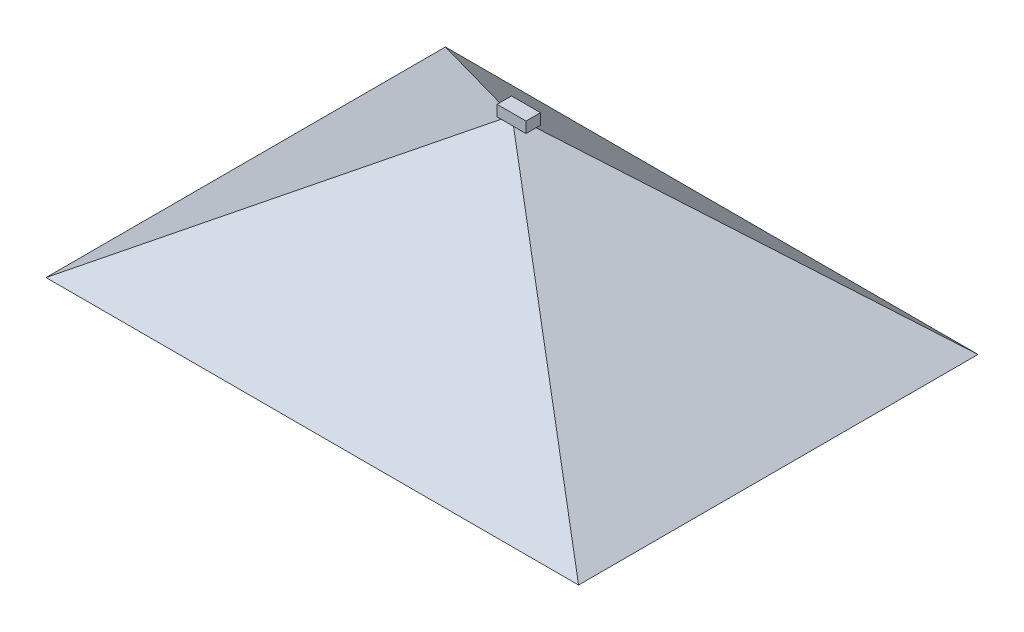
ISO-10303-21;
HEADER;
FILE_DESCRIPTION(('STEP AP214'),'2;1');
FILE_NAME('part.step','',(''),(''),'','','');
FILE_SCHEMA(('AUTOMOTIVE_DESIGN { 1 0 10303 214 1 1 1 1 }'));
ENDSEC;
DATA;
#1=APPLICATION_CONTEXT('core data for automotive mechanical design processes');
#2=APPLICATION_PROTOCOL_DEFINITION('international standard','automotive_design',2000,#1);
#3=PRODUCT_CONTEXT('',#1,'mechanical');
#4=PRODUCT('Part','Part','',(#3));
#5=PRODUCT_RELATED_PRODUCT_CATEGORY('part','',(#4));
#6=PRODUCT_DEFINITION_FORMATION('','',#4);
#7=PRODUCT_DEFINITION_CONTEXT('part definition',#1,'design');
#8=PRODUCT_DEFINITION('design','',#6,#7);
#9=PRODUCT_DEFINITION_SHAPE('','',#8);
#10=(LENGTH_UNIT() NAMED_UNIT(*) SI_UNIT(.MILLI.,.METRE.));
#11=(NAMED_UNIT(*) PLANE_ANGLE_UNIT() SI_UNIT($,.RADIAN.));
#12=(NAMED_UNIT(*) SI_UNIT($,.STERADIAN.) SOLID_ANGLE_UNIT());
#13=UNCERTAINTY_MEASURE_WITH_UNIT(LENGTH_MEASURE(1.E-05),#10,'distance_accuracy_value','');
#14=(GEOMETRIC_REPRESENTATION_CONTEXT(3) GLOBAL_UNCERTAINTY_ASSIGNED_CONTEXT((#13)) GLOBAL_UNIT_ASSIGNED_CONTEXT((#10,
#11,#12)) REPRESENTATION_CONTEXT('',''));
#15=CARTESIAN_POINT('',(0.,0.,0.));
#16=DIRECTION('',(0.,0.,1.));
#17=DIRECTION('',(1.,0.,0.));
#18=AXIS2_PLACEMENT_3D('',#15,#16,#17);
#19=CARTESIAN_POINT('',(0.,-302.26,0.));
#20=DIRECTION('',(0.,-1.,0.));
#21=DIRECTION('',(0.,0.,-1.));
#22=AXIS2_PLACEMENT_3D('',#19,#20,#21);
#23=PLANE('',#22);
#24=DIRECTION('',(0.,0.,1.));
#25=VECTOR('',#24,1.);
#26=CARTESIAN_POINT('',(455.529193006153,-302.26,-350.52));
#27=LINE('',#26,#25);
#28=CARTESIAN_POINT('',(455.529193006153,-302.26,-350.52));
#29=VERTEX_POINT('',#28);
#30=CARTESIAN_POINT('',(455.529193006153,-302.26,350.52));
#31=VERTEX_POINT('',#30);
#32=EDGE_CURVE('E92',#29,#31,#27,.T.);
#33=ORIENTED_EDGE('',*,*,#32,.T.);
#34=DIRECTION('',(-1.,0.,0.));
#35=VECTOR('',#34,1.);
#36=CARTESIAN_POINT('',(455.529193006153,-302.26,350.52));
#37=LINE('',#36,#35);
#38=CARTESIAN_POINT('',(-479.190806993847,-302.26,350.52));
#39=VERTEX_POINT('',#38);
#40=EDGE_CURVE('E76',#31,#39,#37,.T.);
#41=ORIENTED_EDGE('',*,*,#40,.T.);
#42=DIRECTION('',(0.,0.,-1.));
#43=VECTOR('',#42,1.);
#44=CARTESIAN_POINT('',(-479.190806993847,-302.26,-350.52));
#45=LINE('',#44,#43);
#46=CARTESIAN_POINT('',(-479.190806993847,-302.26,-350.52));
#47=VERTEX_POINT('',#46);
#48=EDGE_CURVE('E69',#39,#47,#45,.T.);
#49=ORIENTED_EDGE('',*,*,#48,.T.);
#50=DIRECTION('',(1.,0.,0.));
#51=VECTOR('',#50,1.);
#52=CARTESIAN_POINT('',(455.529193006153,-302.26,-350.52));
#53=LINE('',#52,#51);
#54=EDGE_CURVE('E89',#47,#29,#53,.T.);
#55=ORIENTED_EDGE('',*,*,#54,.T.);
#56=EDGE_LOOP('',(#33,#41,#49,#55));
#57=FACE_BOUND('',#56,.T.);
#58=ADVANCED_FACE('F49',(#57),#23,.T.);
#59=CARTESIAN_POINT('',(0.,1.44635091496229,-1.25769644779329));
#60=DIRECTION('',(0.,-0.754605522163505,0.656178714924787));
#61=DIRECTION('',(0.,-0.656178714924787,-0.754605522163505));
#62=AXIS2_PLACEMENT_3D('',#59,#60,#61);
#63=PLANE('',#62);
#64=DIRECTION('',(0.709267876932364,0.46256600669502,0.531950907699273));
#65=VECTOR('',#64,1.);
#66=CARTESIAN_POINT('',(-479.190806993847,-302.26,-350.52));
#67=LINE('',#66,#65);
#68=CARTESIAN_POINT('',(-11.8308069938468,2.53999999999993,0.));
#69=VERTEX_POINT('',#68);
#70=EDGE_CURVE('E98',#47,#69,#67,.T.);
#71=ORIENTED_EDGE('',*,*,#70,.T.);
#72=DIRECTION('',(-0.709267876932364,0.46256600669502,0.531950907699273));
#73=VECTOR('',#72,1.);
#74=CARTESIAN_POINT('',(455.529193006153,-302.26,-350.52));
#75=LINE('',#74,#73);
#76=EDGE_CURVE('E105',#29,#69,#75,.T.);
#77=ORIENTED_EDGE('',*,*,#76,.F.);
#78=ORIENTED_EDGE('',*,*,#54,.F.);
#79=EDGE_LOOP('',(#71,#77,#78));
#80=FACE_BOUND('',#79,.T.);
#81=ADVANCED_FACE('F109',(#80),#63,.F.);
#82=CARTESIAN_POINT('',(-2.36821163609489,-3.63125784201216,0.));
#83=DIRECTION('',(-0.546267780546922,-0.837610596838614,0.));
#84=DIRECTION('',(0.837610596838614,-0.546267780546922,0.));
#85=AXIS2_PLACEMENT_3D('',#82,#83,#84);
#86=PLANE('',#85);
#87=ORIENTED_EDGE('',*,*,#76,.T.);
#88=DIRECTION('',(-0.709267876932363,0.46256600669502,-0.531950907699273));
#89=VECTOR('',#88,1.);
#90=CARTESIAN_POINT('',(455.529193006153,-302.26,350.52));
#91=LINE('',#90,#89);
#92=EDGE_CURVE('E13',#31,#69,#91,.T.);
#93=ORIENTED_EDGE('',*,*,#92,.F.);
#94=ORIENTED_EDGE('',*,*,#32,.F.);
#95=EDGE_LOOP('',(#87,#93,#94));
#96=FACE_BOUND('',#95,.T.);
#97=ADVANCED_FACE('F104',(#96),#86,.F.);
#98=CARTESIAN_POINT('',(-4.69261481911875,7.19534272264874,0.));
#99=DIRECTION('',(0.546267780546922,-0.837610596838614,0.));
#100=DIRECTION('',(0.837610596838614,0.546267780546922,0.));
#101=AXIS2_PLACEMENT_3D('',#98,#99,#100);
#102=PLANE('',#101);
#103=DIRECTION('',(0.709267876932363,0.46256600669502,-0.531950907699273));
#104=VECTOR('',#103,1.);
#105=CARTESIAN_POINT('',(-479.190806993847,-302.26,350.52));
#106=LINE('',#105,#104);
#107=EDGE_CURVE('E61',#39,#69,#106,.T.);
#108=ORIENTED_EDGE('',*,*,#107,.T.);
#109=ORIENTED_EDGE('',*,*,#70,.F.);
#110=ORIENTED_EDGE('',*,*,#48,.F.);
#111=EDGE_LOOP('',(#108,#109,#110));
#112=FACE_BOUND('',#111,.T.);
#113=ADVANCED_FACE('F121',(#112),#102,.F.);
#114=CARTESIAN_POINT('',(0.,1.44635091496232,1.25769644779332));
#115=DIRECTION('',(0.,-0.754605522163505,-0.656178714924787));
#116=DIRECTION('',(0.,0.656178714924787,-0.754605522163505));
#117=AXIS2_PLACEMENT_3D('',#114,#115,#116);
#118=PLANE('',#117);
#119=ORIENTED_EDGE('',*,*,#92,.T.);
#120=ORIENTED_EDGE('',*,*,#107,.F.);
#121=ORIENTED_EDGE('',*,*,#40,.F.);
#122=EDGE_LOOP('',(#119,#120,#121));
#123=FACE_BOUND('',#122,.T.);
#124=ADVANCED_FACE('F51',(#123),#118,.F.);
#125=CLOSED_SHELL('',(#58,#81,#97,#113,#124));
#126=MANIFOLD_SOLID_BREP('B2',#125);
#127=CARTESIAN_POINT('',(-25.4,19.05,-12.7));
#128=DIRECTION('',(1.,0.,0.));
#129=DIRECTION('',(0.,0.,-1.));
#130=AXIS2_PLACEMENT_3D('',#127,#128,#129);
#131=PLANE('',#130);
#132=DIRECTION('',(0.,0.,1.));
#133=VECTOR('',#132,1.);
#134=CARTESIAN_POINT('',(-25.4,0.,-12.7));
#135=LINE('',#134,#133);
#136=CARTESIAN_POINT('',(-25.4,0.,-12.7));
#137=VERTEX_POINT('',#136);
#138=CARTESIAN_POINT('',(-25.4,0.,12.7));
#139=VERTEX_POINT('',#138);
#140=EDGE_CURVE('E303',#137,#139,#135,.T.);
#141=ORIENTED_EDGE('',*,*,#140,.T.);
#142=DIRECTION('',(0.,-1.,0.));
#143=VECTOR('',#142,1.);
#144=CARTESIAN_POINT('',(-25.4,19.05,12.7));
#145=LINE('',#144,#143);
#146=CARTESIAN_POINT('',(-25.4,19.05,12.7));
#147=VERTEX_POINT('',#146);
#148=EDGE_CURVE('E47',#147,#139,#145,.T.);
#149=ORIENTED_EDGE('',*,*,#148,.F.);
#150=DIRECTION('',(0.,0.,1.));
#151=VECTOR('',#150,1.);
#152=CARTESIAN_POINT('',(-25.4,19.05,-12.7));
#153=LINE('',#152,#151);
#154=CARTESIAN_POINT('',(-25.4,19.05,-12.7));
#155=VERTEX_POINT('',#154);
#156=EDGE_CURVE('E288',#155,#147,#153,.T.);
#157=ORIENTED_EDGE('',*,*,#156,.F.);
#158=DIRECTION('',(0.,-1.,0.));
#159=VECTOR('',#158,1.);
#160=CARTESIAN_POINT('',(-25.4,19.05,-12.7));
#161=LINE('',#160,#159);
#162=EDGE_CURVE('E299',#155,#137,#161,.T.);
#163=ORIENTED_EDGE('',*,*,#162,.T.);
#164=EDGE_LOOP('',(#141,#149,#157,#163));
#165=FACE_BOUND('',#164,.T.);
#166=ADVANCED_FACE('F237',(#165),#131,.F.);
#167=CARTESIAN_POINT('',(-25.4,19.05,12.7));
#168=DIRECTION('',(0.,0.,-1.));
#169=DIRECTION('',(-1.,0.,0.));
#170=AXIS2_PLACEMENT_3D('',#167,#168,#169);
#171=PLANE('',#170);
#172=DIRECTION('',(1.,0.,0.));
#173=VECTOR('',#172,1.);
#174=CARTESIAN_POINT('',(-25.4,0.,12.7));
#175=LINE('',#174,#173);
#176=CARTESIAN_POINT('',(25.4,0.,12.7));
#177=VERTEX_POINT('',#176);
#178=EDGE_CURVE('E293',#139,#177,#175,.T.);
#179=ORIENTED_EDGE('',*,*,#178,.T.);
#180=DIRECTION('',(0.,-1.,0.));
#181=VECTOR('',#180,1.);
#182=CARTESIAN_POINT('',(25.4,19.05,12.7));
#183=LINE('',#182,#181);
#184=CARTESIAN_POINT('',(25.4,19.05,12.7));
#185=VERTEX_POINT('',#184);
#186=EDGE_CURVE('E244',#185,#177,#183,.T.);
#187=ORIENTED_EDGE('',*,*,#186,.F.);
#188=DIRECTION('',(1.,0.,0.));
#189=VECTOR('',#188,1.);
#190=CARTESIAN_POINT('',(-25.4,19.05,12.7));
#191=LINE('',#190,#189);
#192=EDGE_CURVE('E282',#147,#185,#191,.T.);
#193=ORIENTED_EDGE('',*,*,#192,.F.);
#194=ORIENTED_EDGE('',*,*,#148,.T.);
#195=EDGE_LOOP('',(#179,#187,#193,#194));
#196=FACE_BOUND('',#195,.T.);
#197=ADVANCED_FACE('F292',(#196),#171,.F.);
#198=CARTESIAN_POINT('',(25.4,19.05,-12.7));
#199=DIRECTION('',(-1.,0.,0.));
#200=DIRECTION('',(0.,0.,1.));
#201=AXIS2_PLACEMENT_3D('',#198,#199,#200);
#202=PLANE('',#201);
#203=DIRECTION('',(0.,0.,-1.));
#204=VECTOR('',#203,1.);
#205=CARTESIAN_POINT('',(25.4,0.,-12.7));
#206=LINE('',#205,#204);
#207=CARTESIAN_POINT('',(25.4,0.,-12.7));
#208=VERTEX_POINT('',#207);
#209=EDGE_CURVE('E308',#177,#208,#206,.T.);
#210=ORIENTED_EDGE('',*,*,#209,.T.);
#211=DIRECTION('',(0.,-1.,0.));
#212=VECTOR('',#211,1.);
#213=CARTESIAN_POINT('',(25.4,19.05,-12.7));
#214=LINE('',#213,#212);
#215=CARTESIAN_POINT('',(25.4,19.05,-12.7));
#216=VERTEX_POINT('',#215);
#217=EDGE_CURVE('E296',#216,#208,#214,.T.);
#218=ORIENTED_EDGE('',*,*,#217,.F.);
#219=DIRECTION('',(0.,0.,-1.));
#220=VECTOR('',#219,1.);
#221=CARTESIAN_POINT('',(25.4,19.05,-12.7));
#222=LINE('',#221,#220);
#223=EDGE_CURVE('E285',#185,#216,#222,.T.);
#224=ORIENTED_EDGE('',*,*,#223,.F.);
#225=ORIENTED_EDGE('',*,*,#186,.T.);
#226=EDGE_LOOP('',(#210,#218,#224,#225));
#227=FACE_BOUND('',#226,.T.);
#228=ADVANCED_FACE('F297',(#227),#202,.F.);
#229=CARTESIAN_POINT('',(-25.4,19.05,-12.7));
#230=DIRECTION('',(0.,0.,1.));
#231=DIRECTION('',(1.,0.,0.));
#232=AXIS2_PLACEMENT_3D('',#229,#230,#231);
#233=PLANE('',#232);
#234=DIRECTION('',(-1.,0.,0.));
#235=VECTOR('',#234,1.);
#236=CARTESIAN_POINT('',(-25.4,0.,-12.7));
#237=LINE('',#236,#235);
#238=EDGE_CURVE('E275',#208,#137,#237,.T.);
#239=ORIENTED_EDGE('',*,*,#238,.T.);
#240=ORIENTED_EDGE('',*,*,#162,.F.);
#241=DIRECTION('',(-1.,0.,0.));
#242=VECTOR('',#241,1.);
#243=CARTESIAN_POINT('',(-25.4,19.05,-12.7));
#244=LINE('',#243,#242);
#245=EDGE_CURVE('E255',#216,#155,#244,.T.);
#246=ORIENTED_EDGE('',*,*,#245,.F.);
#247=ORIENTED_EDGE('',*,*,#217,.T.);
#248=EDGE_LOOP('',(#239,#240,#246,#247));
#249=FACE_BOUND('',#248,.T.);
#250=ADVANCED_FACE('F312',(#249),#233,.F.);
#251=CARTESIAN_POINT('',(0.,19.05,0.));
#252=DIRECTION('',(0.,1.,0.));
#253=DIRECTION('',(0.,0.,1.));
#254=AXIS2_PLACEMENT_3D('',#251,#252,#253);
#255=PLANE('',#254);
#256=ORIENTED_EDGE('',*,*,#156,.T.);
#257=ORIENTED_EDGE('',*,*,#192,.T.);
#258=ORIENTED_EDGE('',*,*,#223,.T.);
#259=ORIENTED_EDGE('',*,*,#245,.T.);
#260=EDGE_LOOP('',(#256,#257,#258,#259));
#261=FACE_BOUND('',#260,.T.);
#262=ADVANCED_FACE('F283',(#261),#255,.T.);
#263=CARTESIAN_POINT('',(0.,0.,0.));
#264=DIRECTION('',(0.,1.,0.));
#265=DIRECTION('',(0.,0.,1.));
#266=AXIS2_PLACEMENT_3D('',#263,#264,#265);
#267=PLANE('',#266);
#268=CARTESIAN_POINT('',(-11.8308069938468,0.,0.));
#269=DIRECTION('',(0.,-1.,0.));
#270=DIRECTION('',(0.,0.,-1.));
#271=AXIS2_PLACEMENT_3D('',#268,#269,#270);
#272=CIRCLE('',#271,7.63501602294788);
#273=CARTESIAN_POINT('',(-11.8308069938468,0.,-7.63501602294788));
#274=VERTEX_POINT('',#273);
#275=EDGE_CURVE('E318',#274,#274,#272,.T.);
#276=ORIENTED_EDGE('',*,*,#275,.F.);
#277=EDGE_LOOP('',(#276));
#278=FACE_BOUND('',#277,.T.);
#279=ORIENTED_EDGE('',*,*,#140,.F.);
#280=ORIENTED_EDGE('',*,*,#238,.F.);
#281=ORIENTED_EDGE('',*,*,#209,.F.);
#282=ORIENTED_EDGE('',*,*,#178,.F.);
#283=EDGE_LOOP('',(#279,#280,#281,#282));
#284=FACE_BOUND('',#283,.T.);
#285=ADVANCED_FACE('F315',(#278,#284),#267,.F.);
#286=CARTESIAN_POINT('',(-11.8308069938468,2.54,0.));
#287=DIRECTION('',(0.,-1.,0.));
#288=DIRECTION('',(0.,0.,-1.));
#289=AXIS2_PLACEMENT_3D('',#286,#287,#288);
#290=CYLINDRICAL_SURFACE('',#289,7.63501602294788);
#291=CARTESIAN_POINT('',(-11.8308069938468,2.54,0.));
#292=DIRECTION('',(0.,-1.,0.));
#293=DIRECTION('',(0.,0.,-1.));
#294=AXIS2_PLACEMENT_3D('',#291,#292,#293);
#295=CIRCLE('',#294,7.63501602294788);
#296=CARTESIAN_POINT('',(-11.8308069938468,2.54,-7.63501602294788));
#297=VERTEX_POINT('',#296);
#298=EDGE_CURVE('E306',#297,#297,#295,.T.);
#299=ORIENTED_EDGE('',*,*,#298,.F.);
#300=EDGE_LOOP('',(#299));
#301=FACE_BOUND('',#300,.T.);
#302=ORIENTED_EDGE('',*,*,#275,.T.);
#303=EDGE_LOOP('',(#302));
#304=FACE_BOUND('',#303,.T.);
#305=ADVANCED_FACE('F326',(#301,#304),#290,.F.);
#306=CARTESIAN_POINT('',(-11.8308069938468,2.54,0.));
#307=DIRECTION('',(0.,-1.,0.));
#308=DIRECTION('',(0.,0.,-1.));
#309=AXIS2_PLACEMENT_3D('',#306,#307,#308);
#310=PLANE('',#309);
#311=CARTESIAN_POINT('',(-11.830806993847,2.53999999999997,0.));
#312=VERTEX_POINT('',#311);
#313=VERTEX_LOOP('',#312);
#314=FACE_BOUND('',#313,.T.);
#315=ORIENTED_EDGE('',*,*,#298,.T.);
#316=EDGE_LOOP('',(#315));
#317=FACE_BOUND('',#316,.T.);
#318=ADVANCED_FACE('F324',(#314,#317),#310,.T.);
#319=CLOSED_SHELL('',(#166,#197,#228,#250,#262,#285,#305,#318));
#320=MANIFOLD_SOLID_BREP('B7',#319);
#321=ADVANCED_BREP_SHAPE_REPRESENTATION('',(#18,#126,#320),#14);
#322=SHAPE_DEFINITION_REPRESENTATION(#9,#321);
ENDSEC;
END-ISO-10303-21;
